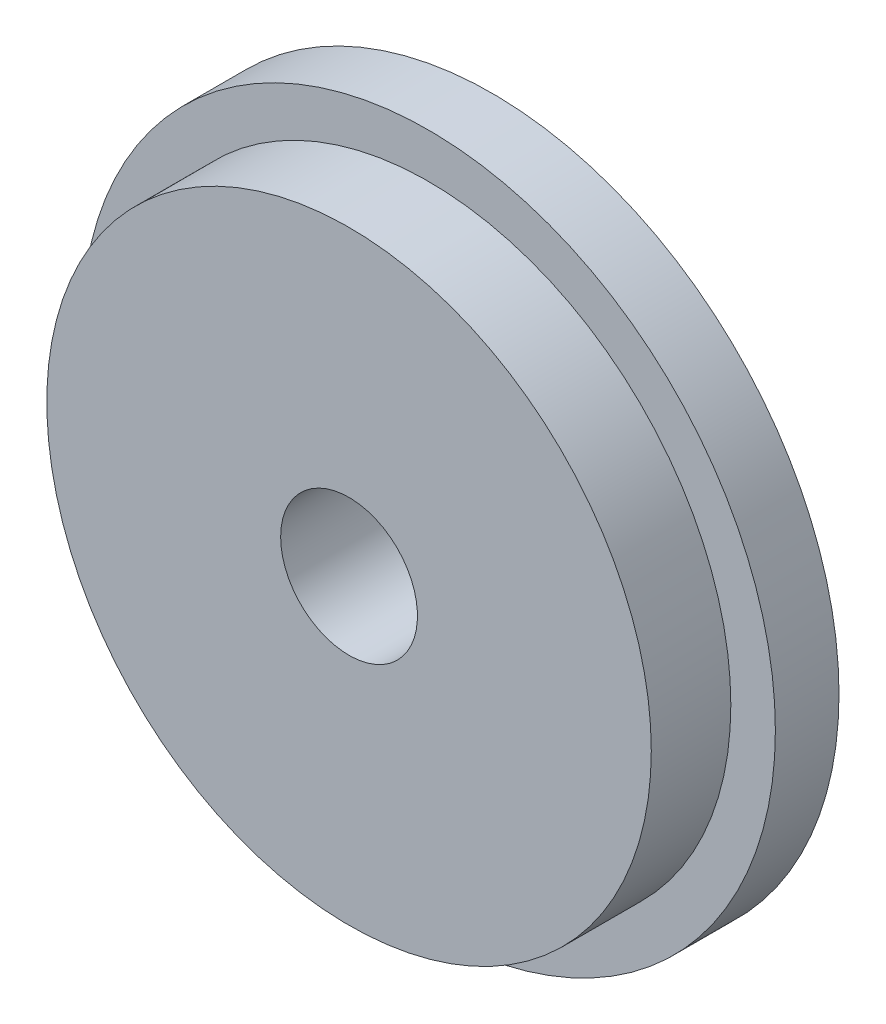
ISO-10303-21;
HEADER;
FILE_DESCRIPTION(('STEP AP214'),'2;1');
FILE_NAME('part.step','',(''),(''),'','','');
FILE_SCHEMA(('AUTOMOTIVE_DESIGN { 1 0 10303 214 1 1 1 1 }'));
ENDSEC;
DATA;
#1=APPLICATION_CONTEXT('core data for automotive mechanical design processes');
#2=APPLICATION_PROTOCOL_DEFINITION('international standard','automotive_design',2000,#1);
#3=PRODUCT_CONTEXT('',#1,'mechanical');
#4=PRODUCT('Part','Part','',(#3));
#5=PRODUCT_RELATED_PRODUCT_CATEGORY('part','',(#4));
#6=PRODUCT_DEFINITION_FORMATION('','',#4);
#7=PRODUCT_DEFINITION_CONTEXT('part definition',#1,'design');
#8=PRODUCT_DEFINITION('design','',#6,#7);
#9=PRODUCT_DEFINITION_SHAPE('','',#8);
#10=(LENGTH_UNIT() NAMED_UNIT(*) SI_UNIT(.MILLI.,.METRE.));
#11=(NAMED_UNIT(*) PLANE_ANGLE_UNIT() SI_UNIT($,.RADIAN.));
#12=(NAMED_UNIT(*) SI_UNIT($,.STERADIAN.) SOLID_ANGLE_UNIT());
#13=UNCERTAINTY_MEASURE_WITH_UNIT(LENGTH_MEASURE(1.E-05),#10,'distance_accuracy_value','');
#14=(GEOMETRIC_REPRESENTATION_CONTEXT(3) GLOBAL_UNCERTAINTY_ASSIGNED_CONTEXT((#13)) GLOBAL_UNIT_ASSIGNED_CONTEXT((#10,
#11,#12)) REPRESENTATION_CONTEXT('',''));
#15=CARTESIAN_POINT('',(0.,0.,0.));
#16=DIRECTION('',(0.,0.,1.));
#17=DIRECTION('',(1.,0.,0.));
#18=AXIS2_PLACEMENT_3D('',#15,#16,#17);
#19=CARTESIAN_POINT('',(0.,0.,2.));
#20=DIRECTION('',(0.,0.,1.));
#21=DIRECTION('',(1.,0.,0.));
#22=AXIS2_PLACEMENT_3D('',#19,#20,#21);
#23=PLANE('',#22);
#24=CARTESIAN_POINT('',(0.,0.,2.));
#25=DIRECTION('',(0.,0.,1.));
#26=DIRECTION('',(1.,0.,0.));
#27=AXIS2_PLACEMENT_3D('',#24,#25,#26);
#28=CIRCLE('',#27,10.9);
#29=CARTESIAN_POINT('',(10.9,0.,2.));
#30=VERTEX_POINT('',#29);
#31=EDGE_CURVE('E10',#30,#30,#28,.T.);
#32=ORIENTED_EDGE('',*,*,#31,.T.);
#33=EDGE_LOOP('',(#32));
#34=FACE_BOUND('',#33,.T.);
#35=CARTESIAN_POINT('',(0.,0.,2.));
#36=DIRECTION('',(0.,0.,1.));
#37=DIRECTION('',(1.,0.,0.));
#38=AXIS2_PLACEMENT_3D('',#35,#36,#37);
#39=CIRCLE('',#38,9.5);
#40=CARTESIAN_POINT('',(9.5,0.,2.));
#41=VERTEX_POINT('',#40);
#42=EDGE_CURVE('E42',#41,#41,#39,.T.);
#43=ORIENTED_EDGE('',*,*,#42,.F.);
#44=EDGE_LOOP('',(#43));
#45=FACE_BOUND('',#44,.T.);
#46=ADVANCED_FACE('F29',(#34,#45),#23,.T.);
#47=CARTESIAN_POINT('',(0.,0.,2.));
#48=DIRECTION('',(0.,0.,-1.));
#49=DIRECTION('',(-1.,0.,0.));
#50=AXIS2_PLACEMENT_3D('',#47,#48,#49);
#51=CYLINDRICAL_SURFACE('',#50,10.9);
#52=ORIENTED_EDGE('',*,*,#31,.F.);
#53=EDGE_LOOP('',(#52));
#54=FACE_BOUND('',#53,.T.);
#55=CARTESIAN_POINT('',(0.,0.,0.));
#56=DIRECTION('',(0.,0.,1.));
#57=DIRECTION('',(1.,0.,0.));
#58=AXIS2_PLACEMENT_3D('',#55,#56,#57);
#59=CIRCLE('',#58,10.9);
#60=CARTESIAN_POINT('',(10.9,0.,0.));
#61=VERTEX_POINT('',#60);
#62=EDGE_CURVE('E33',#61,#61,#59,.T.);
#63=ORIENTED_EDGE('',*,*,#62,.T.);
#64=EDGE_LOOP('',(#63));
#65=FACE_BOUND('',#64,.T.);
#66=ADVANCED_FACE('F31',(#54,#65),#51,.T.);
#67=CARTESIAN_POINT('',(0.,0.,0.));
#68=DIRECTION('',(0.,0.,1.));
#69=DIRECTION('',(1.,0.,0.));
#70=AXIS2_PLACEMENT_3D('',#67,#68,#69);
#71=PLANE('',#70);
#72=CARTESIAN_POINT('',(0.,0.,0.));
#73=DIRECTION('',(0.,0.,-1.));
#74=DIRECTION('',(-1.,0.,0.));
#75=AXIS2_PLACEMENT_3D('',#72,#73,#74);
#76=CIRCLE('',#75,2.15);
#77=CARTESIAN_POINT('',(-2.15,0.,0.));
#78=VERTEX_POINT('',#77);
#79=EDGE_CURVE('E48',#78,#78,#76,.T.);
#80=ORIENTED_EDGE('',*,*,#79,.F.);
#81=EDGE_LOOP('',(#80));
#82=FACE_BOUND('',#81,.T.);
#83=ORIENTED_EDGE('',*,*,#62,.F.);
#84=EDGE_LOOP('',(#83));
#85=FACE_BOUND('',#84,.T.);
#86=ADVANCED_FACE('F63',(#82,#85),#71,.F.);
#87=CARTESIAN_POINT('',(0.,0.,4.5));
#88=DIRECTION('',(0.,0.,-1.));
#89=DIRECTION('',(-1.,0.,0.));
#90=AXIS2_PLACEMENT_3D('',#87,#88,#89);
#91=CYLINDRICAL_SURFACE('',#90,9.5);
#92=CARTESIAN_POINT('',(0.,0.,4.5));
#93=DIRECTION('',(0.,0.,1.));
#94=DIRECTION('',(1.,0.,0.));
#95=AXIS2_PLACEMENT_3D('',#92,#93,#94);
#96=CIRCLE('',#95,9.5);
#97=CARTESIAN_POINT('',(9.5,0.,4.5));
#98=VERTEX_POINT('',#97);
#99=EDGE_CURVE('E40',#98,#98,#96,.T.);
#100=ORIENTED_EDGE('',*,*,#99,.F.);
#101=EDGE_LOOP('',(#100));
#102=FACE_BOUND('',#101,.T.);
#103=ORIENTED_EDGE('',*,*,#42,.T.);
#104=EDGE_LOOP('',(#103));
#105=FACE_BOUND('',#104,.T.);
#106=ADVANCED_FACE('F66',(#102,#105),#91,.T.);
#107=CARTESIAN_POINT('',(0.,0.,4.5));
#108=DIRECTION('',(0.,0.,1.));
#109=DIRECTION('',(1.,0.,0.));
#110=AXIS2_PLACEMENT_3D('',#107,#108,#109);
#111=PLANE('',#110);
#112=CARTESIAN_POINT('',(0.,0.,4.5));
#113=DIRECTION('',(0.,0.,-1.));
#114=DIRECTION('',(-1.,0.,0.));
#115=AXIS2_PLACEMENT_3D('',#112,#113,#114);
#116=CIRCLE('',#115,2.15);
#117=CARTESIAN_POINT('',(-2.15,0.,4.5));
#118=VERTEX_POINT('',#117);
#119=EDGE_CURVE('E45',#118,#118,#116,.T.);
#120=ORIENTED_EDGE('',*,*,#119,.T.);
#121=EDGE_LOOP('',(#120));
#122=FACE_BOUND('',#121,.T.);
#123=ORIENTED_EDGE('',*,*,#99,.T.);
#124=EDGE_LOOP('',(#123));
#125=FACE_BOUND('',#124,.T.);
#126=ADVANCED_FACE('F54',(#122,#125),#111,.T.);
#127=CARTESIAN_POINT('',(0.,0.,4.5));
#128=DIRECTION('',(0.,0.,-1.));
#129=DIRECTION('',(-1.,0.,0.));
#130=AXIS2_PLACEMENT_3D('',#127,#128,#129);
#131=CYLINDRICAL_SURFACE('',#130,2.15);
#132=ORIENTED_EDGE('',*,*,#119,.F.);
#133=EDGE_LOOP('',(#132));
#134=FACE_BOUND('',#133,.T.);
#135=ORIENTED_EDGE('',*,*,#79,.T.);
#136=EDGE_LOOP('',(#135));
#137=FACE_BOUND('',#136,.T.);
#138=ADVANCED_FACE('F57',(#134,#137),#131,.F.);
#139=CLOSED_SHELL('',(#46,#66,#86,#106,#126,#138));
#140=MANIFOLD_SOLID_BREP('B2',#139);
#141=ADVANCED_BREP_SHAPE_REPRESENTATION('',(#18,#140),#14);
#142=SHAPE_DEFINITION_REPRESENTATION(#9,#141);
ENDSEC;
END-ISO-10303-21;
